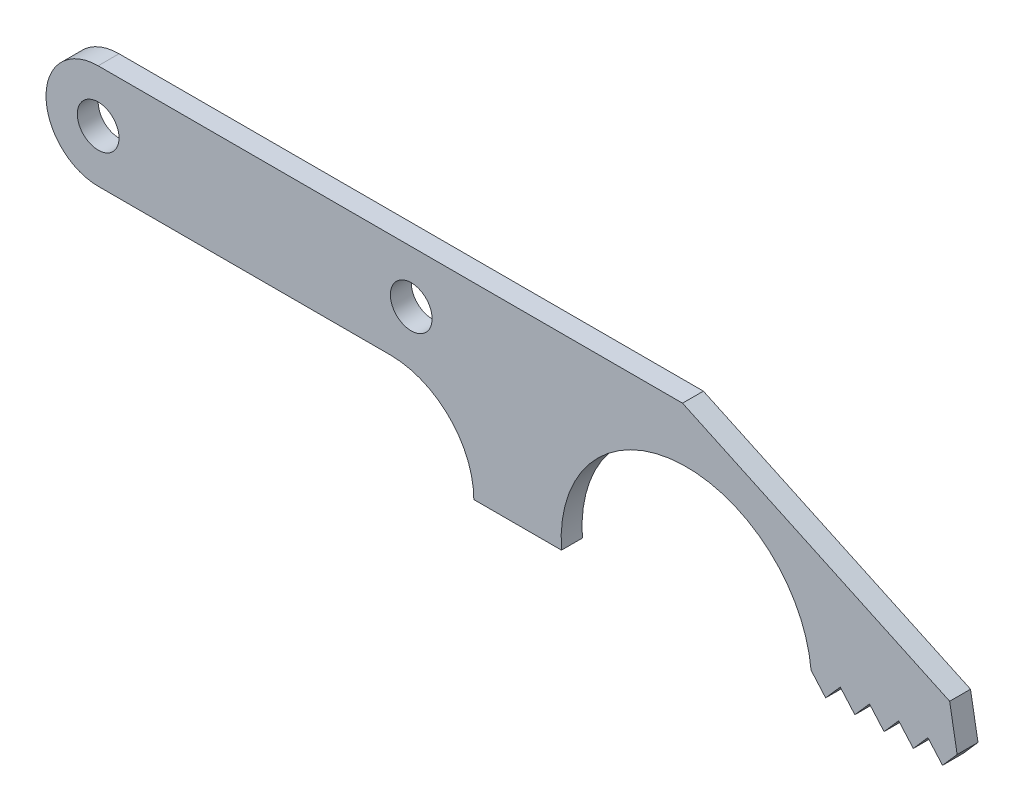
ISO-10303-21;
HEADER;
FILE_DESCRIPTION(('STEP AP214'),'2;1');
FILE_NAME('part.step','',(''),(''),'','','');
FILE_SCHEMA(('AUTOMOTIVE_DESIGN { 1 0 10303 214 1 1 1 1 }'));
ENDSEC;
DATA;
#1=APPLICATION_CONTEXT('core data for automotive mechanical design processes');
#2=APPLICATION_PROTOCOL_DEFINITION('international standard','automotive_design',2000,#1);
#3=PRODUCT_CONTEXT('',#1,'mechanical');
#4=PRODUCT('Part','Part','',(#3));
#5=PRODUCT_RELATED_PRODUCT_CATEGORY('part','',(#4));
#6=PRODUCT_DEFINITION_FORMATION('','',#4);
#7=PRODUCT_DEFINITION_CONTEXT('part definition',#1,'design');
#8=PRODUCT_DEFINITION('design','',#6,#7);
#9=PRODUCT_DEFINITION_SHAPE('','',#8);
#10=(LENGTH_UNIT() NAMED_UNIT(*) SI_UNIT(.MILLI.,.METRE.));
#11=(NAMED_UNIT(*) PLANE_ANGLE_UNIT() SI_UNIT($,.RADIAN.));
#12=(NAMED_UNIT(*) SI_UNIT($,.STERADIAN.) SOLID_ANGLE_UNIT());
#13=UNCERTAINTY_MEASURE_WITH_UNIT(LENGTH_MEASURE(1.E-05),#10,'distance_accuracy_value','');
#14=(GEOMETRIC_REPRESENTATION_CONTEXT(3) GLOBAL_UNCERTAINTY_ASSIGNED_CONTEXT((#13)) GLOBAL_UNIT_ASSIGNED_CONTEXT((#10,
#11,#12)) REPRESENTATION_CONTEXT('',''));
#15=CARTESIAN_POINT('',(0.,0.,0.));
#16=DIRECTION('',(0.,0.,1.));
#17=DIRECTION('',(1.,0.,0.));
#18=AXIS2_PLACEMENT_3D('',#15,#16,#17);
#19=CARTESIAN_POINT('',(0.,25.,2.5));
#20=DIRECTION('',(0.,1.,0.));
#21=DIRECTION('',(0.,0.,1.));
#22=AXIS2_PLACEMENT_3D('',#19,#20,#21);
#23=PLANE('',#22);
#24=DIRECTION('',(1.,0.,0.));
#25=VECTOR('',#24,1.);
#26=CARTESIAN_POINT('',(0.,25.,-2.5));
#27=LINE('',#26,#25);
#28=CARTESIAN_POINT('',(0.,25.,-2.5));
#29=VERTEX_POINT('',#28);
#30=CARTESIAN_POINT('',(140.,25.,-2.5));
#31=VERTEX_POINT('',#30);
#32=EDGE_CURVE('E214',#29,#31,#27,.T.);
#33=ORIENTED_EDGE('',*,*,#32,.F.);
#34=DIRECTION('',(0.,0.,-1.));
#35=VECTOR('',#34,1.);
#36=CARTESIAN_POINT('',(0.,25.,2.5));
#37=LINE('',#36,#35);
#38=CARTESIAN_POINT('',(0.,25.,2.5));
#39=VERTEX_POINT('',#38);
#40=EDGE_CURVE('E11',#39,#29,#37,.T.);
#41=ORIENTED_EDGE('',*,*,#40,.F.);
#42=DIRECTION('',(1.,0.,0.));
#43=VECTOR('',#42,1.);
#44=CARTESIAN_POINT('',(0.,25.,2.5));
#45=LINE('',#44,#43);
#46=CARTESIAN_POINT('',(140.,25.,2.5));
#47=VERTEX_POINT('',#46);
#48=EDGE_CURVE('E621',#39,#47,#45,.T.);
#49=ORIENTED_EDGE('',*,*,#48,.T.);
#50=DIRECTION('',(0.,0.,-1.));
#51=VECTOR('',#50,1.);
#52=CARTESIAN_POINT('',(140.,25.,2.5));
#53=LINE('',#52,#51);
#54=EDGE_CURVE('E65',#47,#31,#53,.T.);
#55=ORIENTED_EDGE('',*,*,#54,.T.);
#56=EDGE_LOOP('',(#33,#41,#49,#55));
#57=FACE_BOUND('',#56,.T.);
#58=ADVANCED_FACE('F47',(#57),#23,.T.);
#59=CARTESIAN_POINT('',(0.,12.5,2.5));
#60=DIRECTION('',(0.,0.,-1.));
#61=DIRECTION('',(-1.,0.,0.));
#62=AXIS2_PLACEMENT_3D('',#59,#60,#61);
#63=CYLINDRICAL_SURFACE('',#62,12.5);
#64=CARTESIAN_POINT('',(0.,12.5,-2.5));
#65=DIRECTION('',(0.,0.,1.));
#66=DIRECTION('',(1.,0.,0.));
#67=AXIS2_PLACEMENT_3D('',#64,#65,#66);
#68=CIRCLE('',#67,12.5);
#69=CARTESIAN_POINT('',(0.,0.,-2.5));
#70=VERTEX_POINT('',#69);
#71=EDGE_CURVE('E217',#29,#70,#68,.T.);
#72=ORIENTED_EDGE('',*,*,#71,.T.);
#73=DIRECTION('',(0.,0.,-1.));
#74=VECTOR('',#73,1.);
#75=CARTESIAN_POINT('',(0.,0.,2.5));
#76=LINE('',#75,#74);
#77=CARTESIAN_POINT('',(0.,0.,2.5));
#78=VERTEX_POINT('',#77);
#79=EDGE_CURVE('E57',#78,#70,#76,.T.);
#80=ORIENTED_EDGE('',*,*,#79,.F.);
#81=CARTESIAN_POINT('',(0.,12.5,2.5));
#82=DIRECTION('',(0.,0.,1.));
#83=DIRECTION('',(1.,0.,0.));
#84=AXIS2_PLACEMENT_3D('',#81,#82,#83);
#85=CIRCLE('',#84,12.5);
#86=EDGE_CURVE('E573',#39,#78,#85,.T.);
#87=ORIENTED_EDGE('',*,*,#86,.F.);
#88=ORIENTED_EDGE('',*,*,#40,.T.);
#89=EDGE_LOOP('',(#72,#80,#87,#88));
#90=FACE_BOUND('',#89,.T.);
#91=ADVANCED_FACE('F347',(#90),#63,.T.);
#92=CARTESIAN_POINT('',(0.,0.,2.5));
#93=DIRECTION('',(0.,1.,0.));
#94=DIRECTION('',(0.,0.,1.));
#95=AXIS2_PLACEMENT_3D('',#92,#93,#94);
#96=PLANE('',#95);
#97=DIRECTION('',(1.,0.,0.));
#98=VECTOR('',#97,1.);
#99=CARTESIAN_POINT('',(0.,0.,-2.5));
#100=LINE('',#99,#98);
#101=CARTESIAN_POINT('',(70.,0.,-2.5));
#102=VERTEX_POINT('',#101);
#103=EDGE_CURVE('E221',#70,#102,#100,.T.);
#104=ORIENTED_EDGE('',*,*,#103,.T.);
#105=DIRECTION('',(0.,0.,-1.));
#106=VECTOR('',#105,1.);
#107=CARTESIAN_POINT('',(70.,0.,2.5));
#108=LINE('',#107,#106);
#109=CARTESIAN_POINT('',(70.,0.,2.5));
#110=VERTEX_POINT('',#109);
#111=EDGE_CURVE('E333',#110,#102,#108,.T.);
#112=ORIENTED_EDGE('',*,*,#111,.F.);
#113=DIRECTION('',(1.,0.,0.));
#114=VECTOR('',#113,1.);
#115=CARTESIAN_POINT('',(0.,0.,2.5));
#116=LINE('',#115,#114);
#117=EDGE_CURVE('E343',#78,#110,#116,.T.);
#118=ORIENTED_EDGE('',*,*,#117,.F.);
#119=ORIENTED_EDGE('',*,*,#79,.T.);
#120=EDGE_LOOP('',(#104,#112,#118,#119));
#121=FACE_BOUND('',#120,.T.);
#122=ADVANCED_FACE('F340',(#121),#96,.F.);
#123=CARTESIAN_POINT('',(70.,-20.,2.5));
#124=DIRECTION('',(0.,0.,-1.));
#125=DIRECTION('',(-1.,0.,0.));
#126=AXIS2_PLACEMENT_3D('',#123,#124,#125);
#127=CYLINDRICAL_SURFACE('',#126,20.);
#128=CARTESIAN_POINT('',(70.,-20.,-2.5));
#129=DIRECTION('',(0.,0.,1.));
#130=DIRECTION('',(1.,0.,0.));
#131=AXIS2_PLACEMENT_3D('',#128,#129,#130);
#132=CIRCLE('',#131,20.);
#133=CARTESIAN_POINT('',(90.,-20.,-2.5));
#134=VERTEX_POINT('',#133);
#135=EDGE_CURVE('E225',#102,#134,#132,.F.);
#136=ORIENTED_EDGE('',*,*,#135,.T.);
#137=DIRECTION('',(0.,0.,-1.));
#138=VECTOR('',#137,1.);
#139=CARTESIAN_POINT('',(90.,-20.,2.5));
#140=LINE('',#139,#138);
#141=CARTESIAN_POINT('',(90.,-20.,2.5));
#142=VERTEX_POINT('',#141);
#143=EDGE_CURVE('E329',#142,#134,#140,.T.);
#144=ORIENTED_EDGE('',*,*,#143,.F.);
#145=CARTESIAN_POINT('',(70.,-20.,2.5));
#146=DIRECTION('',(0.,0.,1.));
#147=DIRECTION('',(1.,0.,0.));
#148=AXIS2_PLACEMENT_3D('',#145,#146,#147);
#149=CIRCLE('',#148,20.);
#150=EDGE_CURVE('E568',#110,#142,#149,.F.);
#151=ORIENTED_EDGE('',*,*,#150,.F.);
#152=ORIENTED_EDGE('',*,*,#111,.T.);
#153=EDGE_LOOP('',(#136,#144,#151,#152));
#154=FACE_BOUND('',#153,.T.);
#155=ADVANCED_FACE('F429',(#154),#127,.F.);
#156=CARTESIAN_POINT('',(0.,-20.,2.5));
#157=DIRECTION('',(0.,1.,0.));
#158=DIRECTION('',(0.,0.,1.));
#159=AXIS2_PLACEMENT_3D('',#156,#157,#158);
#160=PLANE('',#159);
#161=DIRECTION('',(1.,0.,0.));
#162=VECTOR('',#161,1.);
#163=CARTESIAN_POINT('',(0.,-20.,-2.5));
#164=LINE('',#163,#162);
#165=CARTESIAN_POINT('',(111.,-20.,-2.5));
#166=VERTEX_POINT('',#165);
#167=EDGE_CURVE('E229',#134,#166,#164,.T.);
#168=ORIENTED_EDGE('',*,*,#167,.T.);
#169=DIRECTION('',(0.,0.,-1.));
#170=VECTOR('',#169,1.);
#171=CARTESIAN_POINT('',(111.,-20.,2.5));
#172=LINE('',#171,#170);
#173=CARTESIAN_POINT('',(111.,-20.,2.5));
#174=VERTEX_POINT('',#173);
#175=EDGE_CURVE('E325',#174,#166,#172,.T.);
#176=ORIENTED_EDGE('',*,*,#175,.F.);
#177=DIRECTION('',(1.,0.,0.));
#178=VECTOR('',#177,1.);
#179=CARTESIAN_POINT('',(0.,-20.,2.5));
#180=LINE('',#179,#178);
#181=EDGE_CURVE('E563',#142,#174,#180,.T.);
#182=ORIENTED_EDGE('',*,*,#181,.F.);
#183=ORIENTED_EDGE('',*,*,#143,.T.);
#184=EDGE_LOOP('',(#168,#176,#182,#183));
#185=FACE_BOUND('',#184,.T.);
#186=ADVANCED_FACE('F425',(#185),#160,.F.);
#187=CARTESIAN_POINT('',(140.914787694969,-17.7404697025836,2.5));
#188=DIRECTION('',(0.,0.,-1.));
#189=DIRECTION('',(-1.,0.,0.));
#190=AXIS2_PLACEMENT_3D('',#187,#188,#189);
#191=CYLINDRICAL_SURFACE('',#190,30.);
#192=CARTESIAN_POINT('',(140.914787694969,-17.7404697025836,-2.5));
#193=DIRECTION('',(0.,0.,1.));
#194=DIRECTION('',(1.,0.,0.));
#195=AXIS2_PLACEMENT_3D('',#192,#193,#194);
#196=CIRCLE('',#195,30.);
#197=CARTESIAN_POINT('',(170.789355906229,-15.,-2.5));
#198=VERTEX_POINT('',#197);
#199=EDGE_CURVE('E233',#166,#198,#196,.F.);
#200=ORIENTED_EDGE('',*,*,#199,.T.);
#201=DIRECTION('',(0.,0.,-1.));
#202=VECTOR('',#201,1.);
#203=CARTESIAN_POINT('',(170.789355906229,-15.,2.5));
#204=LINE('',#203,#202);
#205=CARTESIAN_POINT('',(170.789355906229,-15.,2.5));
#206=VERTEX_POINT('',#205);
#207=EDGE_CURVE('E321',#206,#198,#204,.T.);
#208=ORIENTED_EDGE('',*,*,#207,.F.);
#209=CARTESIAN_POINT('',(140.914787694969,-17.7404697025836,2.5));
#210=DIRECTION('',(0.,0.,1.));
#211=DIRECTION('',(1.,0.,0.));
#212=AXIS2_PLACEMENT_3D('',#209,#210,#211);
#213=CIRCLE('',#212,30.);
#214=EDGE_CURVE('E567',#174,#206,#213,.F.);
#215=ORIENTED_EDGE('',*,*,#214,.F.);
#216=ORIENTED_EDGE('',*,*,#175,.T.);
#217=EDGE_LOOP('',(#200,#208,#215,#216));
#218=FACE_BOUND('',#217,.T.);
#219=ADVANCED_FACE('F421',(#218),#191,.F.);
#220=CARTESIAN_POINT('',(89.2966263539702,78.134548059724,2.5));
#221=DIRECTION('',(0.752576694706878,0.658504607868518,0.));
#222=DIRECTION('',(-0.658504607868518,0.752576694706878,0.));
#223=AXIS2_PLACEMENT_3D('',#220,#221,#222);
#224=PLANE('',#223);
#225=DIRECTION('',(0.658504607868518,-0.752576694706878,0.));
#226=VECTOR('',#225,1.);
#227=CARTESIAN_POINT('',(89.2966263539702,78.134548059724,-2.5));
#228=LINE('',#227,#226);
#229=CARTESIAN_POINT('',(174.289355906229,-19.,-2.5));
#230=VERTEX_POINT('',#229);
#231=EDGE_CURVE('E237',#198,#230,#228,.T.);
#232=ORIENTED_EDGE('',*,*,#231,.T.);
#233=DIRECTION('',(0.,0.,-1.));
#234=VECTOR('',#233,1.);
#235=CARTESIAN_POINT('',(174.289355906229,-19.,2.5));
#236=LINE('',#235,#234);
#237=CARTESIAN_POINT('',(174.289355906229,-19.,2.5));
#238=VERTEX_POINT('',#237);
#239=EDGE_CURVE('E317',#238,#230,#236,.T.);
#240=ORIENTED_EDGE('',*,*,#239,.F.);
#241=DIRECTION('',(0.658504607868518,-0.752576694706878,0.));
#242=VECTOR('',#241,1.);
#243=CARTESIAN_POINT('',(89.2966263539702,78.134548059724,2.5));
#244=LINE('',#243,#242);
#245=EDGE_CURVE('E579',#206,#238,#244,.T.);
#246=ORIENTED_EDGE('',*,*,#245,.F.);
#247=ORIENTED_EDGE('',*,*,#207,.T.);
#248=EDGE_LOOP('',(#232,#240,#246,#247));
#249=FACE_BOUND('',#248,.T.);
#250=ADVANCED_FACE('F417',(#249),#224,.F.);
#251=CARTESIAN_POINT('',(108.12848476105,-94.6124241659187,2.5));
#252=DIRECTION('',(-0.752576694706877,0.658504607868519,0.));
#253=DIRECTION('',(-0.658504607868519,-0.752576694706877,0.));
#254=AXIS2_PLACEMENT_3D('',#251,#252,#253);
#255=PLANE('',#254);
#256=DIRECTION('',(0.658504607868519,0.752576694706877,0.));
#257=VECTOR('',#256,1.);
#258=CARTESIAN_POINT('',(108.12848476105,-94.6124241659187,-2.5));
#259=LINE('',#258,#257);
#260=CARTESIAN_POINT('',(177.789355906229,-15.,-2.5));
#261=VERTEX_POINT('',#260);
#262=EDGE_CURVE('E241',#230,#261,#259,.T.);
#263=ORIENTED_EDGE('',*,*,#262,.T.);
#264=DIRECTION('',(0.,0.,-1.));
#265=VECTOR('',#264,1.);
#266=CARTESIAN_POINT('',(177.789355906229,-15.,2.5));
#267=LINE('',#266,#265);
#268=CARTESIAN_POINT('',(177.789355906229,-15.,2.5));
#269=VERTEX_POINT('',#268);
#270=EDGE_CURVE('E313',#269,#261,#267,.T.);
#271=ORIENTED_EDGE('',*,*,#270,.F.);
#272=DIRECTION('',(0.658504607868519,0.752576694706877,0.));
#273=VECTOR('',#272,1.);
#274=CARTESIAN_POINT('',(108.12848476105,-94.6124241659187,2.5));
#275=LINE('',#274,#273);
#276=EDGE_CURVE('E583',#238,#269,#275,.T.);
#277=ORIENTED_EDGE('',*,*,#276,.F.);
#278=ORIENTED_EDGE('',*,*,#239,.T.);
#279=EDGE_LOOP('',(#263,#271,#277,#278));
#280=FACE_BOUND('',#279,.T.);
#281=ADVANCED_FACE('F413',(#280),#255,.F.);
#282=CARTESIAN_POINT('',(93.2612281238816,81.6035746083965,2.5));
#283=DIRECTION('',(0.752576694706877,0.658504607868519,0.));
#284=DIRECTION('',(-0.658504607868519,0.752576694706877,0.));
#285=AXIS2_PLACEMENT_3D('',#282,#283,#284);
#286=PLANE('',#285);
#287=DIRECTION('',(0.658504607868519,-0.752576694706877,0.));
#288=VECTOR('',#287,1.);
#289=CARTESIAN_POINT('',(93.2612281238816,81.6035746083965,-2.5));
#290=LINE('',#289,#288);
#291=CARTESIAN_POINT('',(181.289355906229,-19.,-2.5));
#292=VERTEX_POINT('',#291);
#293=EDGE_CURVE('E245',#261,#292,#290,.T.);
#294=ORIENTED_EDGE('',*,*,#293,.T.);
#295=DIRECTION('',(0.,0.,-1.));
#296=VECTOR('',#295,1.);
#297=CARTESIAN_POINT('',(181.289355906229,-19.,2.5));
#298=LINE('',#297,#296);
#299=CARTESIAN_POINT('',(181.289355906229,-19.,2.5));
#300=VERTEX_POINT('',#299);
#301=EDGE_CURVE('E309',#300,#292,#298,.T.);
#302=ORIENTED_EDGE('',*,*,#301,.F.);
#303=DIRECTION('',(0.658504607868519,-0.752576694706877,0.));
#304=VECTOR('',#303,1.);
#305=CARTESIAN_POINT('',(93.2612281238816,81.6035746083965,2.5));
#306=LINE('',#305,#304);
#307=EDGE_CURVE('E587',#269,#300,#306,.T.);
#308=ORIENTED_EDGE('',*,*,#307,.F.);
#309=ORIENTED_EDGE('',*,*,#270,.T.);
#310=EDGE_LOOP('',(#294,#302,#308,#309));
#311=FACE_BOUND('',#310,.T.);
#312=ADVANCED_FACE('F409',(#311),#286,.F.);
#313=CARTESIAN_POINT('',(112.093086530961,-98.0814507145913,2.5));
#314=DIRECTION('',(-0.752576694706877,0.658504607868519,0.));
#315=DIRECTION('',(-0.658504607868519,-0.752576694706877,0.));
#316=AXIS2_PLACEMENT_3D('',#313,#314,#315);
#317=PLANE('',#316);
#318=DIRECTION('',(0.658504607868519,0.752576694706877,0.));
#319=VECTOR('',#318,1.);
#320=CARTESIAN_POINT('',(112.093086530961,-98.0814507145913,-2.5));
#321=LINE('',#320,#319);
#322=CARTESIAN_POINT('',(184.789355906229,-15.,-2.5));
#323=VERTEX_POINT('',#322);
#324=EDGE_CURVE('E249',#292,#323,#321,.T.);
#325=ORIENTED_EDGE('',*,*,#324,.T.);
#326=DIRECTION('',(0.,0.,-1.));
#327=VECTOR('',#326,1.);
#328=CARTESIAN_POINT('',(184.789355906229,-15.,2.5));
#329=LINE('',#328,#327);
#330=CARTESIAN_POINT('',(184.789355906229,-15.,2.5));
#331=VERTEX_POINT('',#330);
#332=EDGE_CURVE('E305',#331,#323,#329,.T.);
#333=ORIENTED_EDGE('',*,*,#332,.F.);
#334=DIRECTION('',(0.658504607868519,0.752576694706877,0.));
#335=VECTOR('',#334,1.);
#336=CARTESIAN_POINT('',(112.093086530961,-98.0814507145913,2.5));
#337=LINE('',#336,#335);
#338=EDGE_CURVE('E591',#300,#331,#337,.T.);
#339=ORIENTED_EDGE('',*,*,#338,.F.);
#340=ORIENTED_EDGE('',*,*,#301,.T.);
#341=EDGE_LOOP('',(#325,#333,#339,#340));
#342=FACE_BOUND('',#341,.T.);
#343=ADVANCED_FACE('F405',(#342),#317,.F.);
#344=CARTESIAN_POINT('',(97.2258298937931,85.0726011570691,2.5));
#345=DIRECTION('',(0.752576694706877,0.658504607868519,0.));
#346=DIRECTION('',(-0.658504607868519,0.752576694706877,0.));
#347=AXIS2_PLACEMENT_3D('',#344,#345,#346);
#348=PLANE('',#347);
#349=DIRECTION('',(0.658504607868519,-0.752576694706877,0.));
#350=VECTOR('',#349,1.);
#351=CARTESIAN_POINT('',(97.2258298937931,85.0726011570691,-2.5));
#352=LINE('',#351,#350);
#353=CARTESIAN_POINT('',(188.289355906229,-19.,-2.5));
#354=VERTEX_POINT('',#353);
#355=EDGE_CURVE('E253',#323,#354,#352,.T.);
#356=ORIENTED_EDGE('',*,*,#355,.T.);
#357=DIRECTION('',(0.,0.,-1.));
#358=VECTOR('',#357,1.);
#359=CARTESIAN_POINT('',(188.289355906229,-19.,2.5));
#360=LINE('',#359,#358);
#361=CARTESIAN_POINT('',(188.289355906229,-19.,2.5));
#362=VERTEX_POINT('',#361);
#363=EDGE_CURVE('E301',#362,#354,#360,.T.);
#364=ORIENTED_EDGE('',*,*,#363,.F.);
#365=DIRECTION('',(0.658504607868519,-0.752576694706877,0.));
#366=VECTOR('',#365,1.);
#367=CARTESIAN_POINT('',(97.2258298937931,85.0726011570691,2.5));
#368=LINE('',#367,#366);
#369=EDGE_CURVE('E595',#331,#362,#368,.T.);
#370=ORIENTED_EDGE('',*,*,#369,.F.);
#371=ORIENTED_EDGE('',*,*,#332,.T.);
#372=EDGE_LOOP('',(#356,#364,#370,#371));
#373=FACE_BOUND('',#372,.T.);
#374=ADVANCED_FACE('F401',(#373),#348,.F.);
#375=CARTESIAN_POINT('',(116.057688300873,-101.550477263264,2.5));
#376=DIRECTION('',(-0.752576694706877,0.658504607868519,0.));
#377=DIRECTION('',(-0.658504607868519,-0.752576694706877,0.));
#378=AXIS2_PLACEMENT_3D('',#375,#376,#377);
#379=PLANE('',#378);
#380=DIRECTION('',(0.658504607868519,0.752576694706877,0.));
#381=VECTOR('',#380,1.);
#382=CARTESIAN_POINT('',(116.057688300873,-101.550477263264,-2.5));
#383=LINE('',#382,#381);
#384=CARTESIAN_POINT('',(191.789355906229,-15.,-2.5));
#385=VERTEX_POINT('',#384);
#386=EDGE_CURVE('E257',#354,#385,#383,.T.);
#387=ORIENTED_EDGE('',*,*,#386,.T.);
#388=DIRECTION('',(0.,0.,-1.));
#389=VECTOR('',#388,1.);
#390=CARTESIAN_POINT('',(191.789355906229,-15.,2.5));
#391=LINE('',#390,#389);
#392=CARTESIAN_POINT('',(191.789355906229,-15.,2.5));
#393=VERTEX_POINT('',#392);
#394=EDGE_CURVE('E297',#393,#385,#391,.T.);
#395=ORIENTED_EDGE('',*,*,#394,.F.);
#396=DIRECTION('',(0.658504607868519,0.752576694706877,0.));
#397=VECTOR('',#396,1.);
#398=CARTESIAN_POINT('',(116.057688300873,-101.550477263264,2.5));
#399=LINE('',#398,#397);
#400=EDGE_CURVE('E599',#362,#393,#399,.T.);
#401=ORIENTED_EDGE('',*,*,#400,.F.);
#402=ORIENTED_EDGE('',*,*,#363,.T.);
#403=EDGE_LOOP('',(#387,#395,#401,#402));
#404=FACE_BOUND('',#403,.T.);
#405=ADVANCED_FACE('F397',(#404),#379,.F.);
#406=CARTESIAN_POINT('',(101.190431663705,88.5416277057416,2.5));
#407=DIRECTION('',(0.75257669470688,0.658504607868516,0.));
#408=DIRECTION('',(-0.658504607868516,0.75257669470688,0.));
#409=AXIS2_PLACEMENT_3D('',#406,#407,#408);
#410=PLANE('',#409);
#411=DIRECTION('',(0.658504607868516,-0.75257669470688,0.));
#412=VECTOR('',#411,1.);
#413=CARTESIAN_POINT('',(101.190431663705,88.5416277057416,-2.5));
#414=LINE('',#413,#412);
#415=CARTESIAN_POINT('',(195.289355906229,-19.,-2.5));
#416=VERTEX_POINT('',#415);
#417=EDGE_CURVE('E261',#385,#416,#414,.T.);
#418=ORIENTED_EDGE('',*,*,#417,.T.);
#419=DIRECTION('',(0.,0.,-1.));
#420=VECTOR('',#419,1.);
#421=CARTESIAN_POINT('',(195.289355906229,-19.,2.5));
#422=LINE('',#421,#420);
#423=CARTESIAN_POINT('',(195.289355906229,-19.,2.5));
#424=VERTEX_POINT('',#423);
#425=EDGE_CURVE('E293',#424,#416,#422,.T.);
#426=ORIENTED_EDGE('',*,*,#425,.F.);
#427=DIRECTION('',(0.658504607868516,-0.75257669470688,0.));
#428=VECTOR('',#427,1.);
#429=CARTESIAN_POINT('',(101.190431663705,88.5416277057416,2.5));
#430=LINE('',#429,#428);
#431=EDGE_CURVE('E603',#393,#424,#430,.T.);
#432=ORIENTED_EDGE('',*,*,#431,.F.);
#433=ORIENTED_EDGE('',*,*,#394,.T.);
#434=EDGE_LOOP('',(#418,#426,#432,#433));
#435=FACE_BOUND('',#434,.T.);
#436=ADVANCED_FACE('F393',(#435),#410,.F.);
#437=CARTESIAN_POINT('',(120.022290070784,-105.019503811936,2.5));
#438=DIRECTION('',(-0.752576694706877,0.658504607868519,0.));
#439=DIRECTION('',(-0.658504607868519,-0.752576694706877,0.));
#440=AXIS2_PLACEMENT_3D('',#437,#438,#439);
#441=PLANE('',#440);
#442=DIRECTION('',(0.658504607868519,0.752576694706877,0.));
#443=VECTOR('',#442,1.);
#444=CARTESIAN_POINT('',(120.022290070784,-105.019503811936,-2.5));
#445=LINE('',#444,#443);
#446=CARTESIAN_POINT('',(198.789355906229,-15.,-2.5));
#447=VERTEX_POINT('',#446);
#448=EDGE_CURVE('E265',#416,#447,#445,.T.);
#449=ORIENTED_EDGE('',*,*,#448,.T.);
#450=DIRECTION('',(0.,0.,-1.));
#451=VECTOR('',#450,1.);
#452=CARTESIAN_POINT('',(198.789355906229,-15.,2.5));
#453=LINE('',#452,#451);
#454=CARTESIAN_POINT('',(198.789355906229,-15.,2.5));
#455=VERTEX_POINT('',#454);
#456=EDGE_CURVE('E289',#455,#447,#453,.T.);
#457=ORIENTED_EDGE('',*,*,#456,.F.);
#458=DIRECTION('',(0.658504607868519,0.752576694706877,0.));
#459=VECTOR('',#458,1.);
#460=CARTESIAN_POINT('',(120.022290070784,-105.019503811936,2.5));
#461=LINE('',#460,#459);
#462=EDGE_CURVE('E607',#424,#455,#461,.T.);
#463=ORIENTED_EDGE('',*,*,#462,.F.);
#464=ORIENTED_EDGE('',*,*,#425,.T.);
#465=EDGE_LOOP('',(#449,#457,#463,#464));
#466=FACE_BOUND('',#465,.T.);
#467=ADVANCED_FACE('F389',(#466),#441,.F.);
#468=CARTESIAN_POINT('',(105.155033433616,92.0106542544142,2.5));
#469=DIRECTION('',(0.752576694706877,0.658504607868519,0.));
#470=DIRECTION('',(-0.658504607868519,0.752576694706877,0.));
#471=AXIS2_PLACEMENT_3D('',#468,#469,#470);
#472=PLANE('',#471);
#473=DIRECTION('',(0.658504607868519,-0.752576694706877,0.));
#474=VECTOR('',#473,1.);
#475=CARTESIAN_POINT('',(105.155033433616,92.0106542544142,-2.5));
#476=LINE('',#475,#474);
#477=CARTESIAN_POINT('',(202.289355906229,-19.,-2.5));
#478=VERTEX_POINT('',#477);
#479=EDGE_CURVE('E269',#447,#478,#476,.T.);
#480=ORIENTED_EDGE('',*,*,#479,.T.);
#481=DIRECTION('',(0.,0.,-1.));
#482=VECTOR('',#481,1.);
#483=CARTESIAN_POINT('',(202.289355906229,-19.,2.5));
#484=LINE('',#483,#482);
#485=CARTESIAN_POINT('',(202.289355906229,-19.,2.5));
#486=VERTEX_POINT('',#485);
#487=EDGE_CURVE('E196',#486,#478,#484,.T.);
#488=ORIENTED_EDGE('',*,*,#487,.F.);
#489=DIRECTION('',(0.658504607868519,-0.752576694706877,0.));
#490=VECTOR('',#489,1.);
#491=CARTESIAN_POINT('',(105.155033433616,92.0106542544142,2.5));
#492=LINE('',#491,#490);
#493=EDGE_CURVE('E183',#455,#486,#492,.T.);
#494=ORIENTED_EDGE('',*,*,#493,.F.);
#495=ORIENTED_EDGE('',*,*,#456,.T.);
#496=EDGE_LOOP('',(#480,#488,#494,#495));
#497=FACE_BOUND('',#496,.T.);
#498=ADVANCED_FACE('F386',(#497),#472,.F.);
#499=CARTESIAN_POINT('',(123.986891840696,-108.488530360609,2.5));
#500=DIRECTION('',(-0.752576694706877,0.658504607868519,0.));
#501=DIRECTION('',(-0.658504607868519,-0.752576694706877,0.));
#502=AXIS2_PLACEMENT_3D('',#499,#500,#501);
#503=PLANE('',#502);
#504=DIRECTION('',(0.658504607868519,0.752576694706877,0.));
#505=VECTOR('',#504,1.);
#506=CARTESIAN_POINT('',(123.986891840696,-108.488530360609,-2.5));
#507=LINE('',#506,#505);
#508=CARTESIAN_POINT('',(205.789355906229,-15.,-2.5));
#509=VERTEX_POINT('',#508);
#510=EDGE_CURVE('E192',#478,#509,#507,.T.);
#511=ORIENTED_EDGE('',*,*,#510,.T.);
#512=DIRECTION('',(0.,0.,-1.));
#513=VECTOR('',#512,1.);
#514=CARTESIAN_POINT('',(205.789355906229,-15.,2.5));
#515=LINE('',#514,#513);
#516=CARTESIAN_POINT('',(205.789355906229,-15.,2.5));
#517=VERTEX_POINT('',#516);
#518=EDGE_CURVE('E190',#517,#509,#515,.T.);
#519=ORIENTED_EDGE('',*,*,#518,.F.);
#520=DIRECTION('',(0.658504607868519,0.752576694706877,0.));
#521=VECTOR('',#520,1.);
#522=CARTESIAN_POINT('',(123.986891840696,-108.488530360609,2.5));
#523=LINE('',#522,#521);
#524=EDGE_CURVE('E175',#486,#517,#523,.T.);
#525=ORIENTED_EDGE('',*,*,#524,.F.);
#526=ORIENTED_EDGE('',*,*,#487,.T.);
#527=EDGE_LOOP('',(#511,#519,#525,#526));
#528=FACE_BOUND('',#527,.T.);
#529=ADVANCED_FACE('F191',(#528),#503,.F.);
#530=CARTESIAN_POINT('',(197.018896468856,34.7397471568678,2.5));
#531=DIRECTION('',(0.984807753012207,0.173648177666934,0.));
#532=DIRECTION('',(-0.173648177666934,0.984807753012207,0.));
#533=AXIS2_PLACEMENT_3D('',#530,#531,#532);
#534=PLANE('',#533);
#535=DIRECTION('',(0.173648177666934,-0.984807753012207,0.));
#536=VECTOR('',#535,1.);
#537=CARTESIAN_POINT('',(197.018896468856,34.7397471568678,-2.5));
#538=LINE('',#537,#536);
#539=CARTESIAN_POINT('',(203.998392257483,-4.8429404192719,-2.5));
#540=VERTEX_POINT('',#539);
#541=EDGE_CURVE('E275',#540,#509,#538,.T.);
#542=ORIENTED_EDGE('',*,*,#541,.F.);
#543=DIRECTION('',(0.,0.,-1.));
#544=VECTOR('',#543,1.);
#545=CARTESIAN_POINT('',(203.998392257483,-4.8429404192719,2.5));
#546=LINE('',#545,#544);
#547=CARTESIAN_POINT('',(203.998392257483,-4.8429404192719,2.5));
#548=VERTEX_POINT('',#547);
#549=EDGE_CURVE('E120',#548,#540,#546,.T.);
#550=ORIENTED_EDGE('',*,*,#549,.F.);
#551=DIRECTION('',(0.173648177666934,-0.984807753012207,0.));
#552=VECTOR('',#551,1.);
#553=CARTESIAN_POINT('',(197.018896468856,34.7397471568678,2.5));
#554=LINE('',#553,#552);
#555=EDGE_CURVE('E181',#548,#517,#554,.T.);
#556=ORIENTED_EDGE('',*,*,#555,.T.);
#557=ORIENTED_EDGE('',*,*,#518,.T.);
#558=EDGE_LOOP('',(#542,#550,#556,#557));
#559=FACE_BOUND('',#558,.T.);
#560=ADVANCED_FACE('F198',(#559),#534,.T.);
#561=CARTESIAN_POINT('',(0.,12.5,2.5));
#562=DIRECTION('',(0.,0.,-1.));
#563=DIRECTION('',(-1.,0.,0.));
#564=AXIS2_PLACEMENT_3D('',#561,#562,#563);
#565=CYLINDRICAL_SURFACE('',#564,5.);
#566=CARTESIAN_POINT('',(0.,12.5,2.5));
#567=DIRECTION('',(0.,0.,1.));
#568=DIRECTION('',(1.,0.,0.));
#569=AXIS2_PLACEMENT_3D('',#566,#567,#568);
#570=CIRCLE('',#569,5.);
#571=CARTESIAN_POINT('',(5.,12.5,2.5));
#572=VERTEX_POINT('',#571);
#573=EDGE_CURVE('E370',#572,#572,#570,.T.);
#574=ORIENTED_EDGE('',*,*,#573,.T.);
#575=EDGE_LOOP('',(#574));
#576=FACE_BOUND('',#575,.T.);
#577=CARTESIAN_POINT('',(0.,12.5,-2.5));
#578=DIRECTION('',(0.,0.,1.));
#579=DIRECTION('',(1.,0.,0.));
#580=AXIS2_PLACEMENT_3D('',#577,#578,#579);
#581=CIRCLE('',#580,5.);
#582=CARTESIAN_POINT('',(5.,12.5,-2.5));
#583=VERTEX_POINT('',#582);
#584=EDGE_CURVE('E210',#583,#583,#581,.T.);
#585=ORIENTED_EDGE('',*,*,#584,.F.);
#586=EDGE_LOOP('',(#585));
#587=FACE_BOUND('',#586,.T.);
#588=ADVANCED_FACE('F357',(#576,#587),#565,.F.);
#589=CARTESIAN_POINT('',(75.,12.5,2.5));
#590=DIRECTION('',(0.,0.,-1.));
#591=DIRECTION('',(-1.,0.,0.));
#592=AXIS2_PLACEMENT_3D('',#589,#590,#591);
#593=CYLINDRICAL_SURFACE('',#592,5.);
#594=CARTESIAN_POINT('',(75.,12.5,2.5));
#595=DIRECTION('',(0.,0.,1.));
#596=DIRECTION('',(1.,0.,0.));
#597=AXIS2_PLACEMENT_3D('',#594,#595,#596);
#598=CIRCLE('',#597,5.);
#599=CARTESIAN_POINT('',(80.,12.5,2.5));
#600=VERTEX_POINT('',#599);
#601=EDGE_CURVE('E282',#600,#600,#598,.T.);
#602=ORIENTED_EDGE('',*,*,#601,.T.);
#603=EDGE_LOOP('',(#602));
#604=FACE_BOUND('',#603,.T.);
#605=CARTESIAN_POINT('',(75.,12.5,-2.5));
#606=DIRECTION('',(0.,0.,1.));
#607=DIRECTION('',(1.,0.,0.));
#608=AXIS2_PLACEMENT_3D('',#605,#606,#607);
#609=CIRCLE('',#608,5.);
#610=CARTESIAN_POINT('',(80.,12.5,-2.5));
#611=VERTEX_POINT('',#610);
#612=EDGE_CURVE('E206',#611,#611,#609,.T.);
#613=ORIENTED_EDGE('',*,*,#612,.F.);
#614=EDGE_LOOP('',(#613));
#615=FACE_BOUND('',#614,.T.);
#616=ADVANCED_FACE('F49',(#604,#615),#593,.F.);
#617=CARTESIAN_POINT('',(34.5804228609296,74.1579561394103,2.5));
#618=DIRECTION('',(0.4226182617407,0.90630778703665,0.));
#619=DIRECTION('',(-0.90630778703665,0.4226182617407,0.));
#620=AXIS2_PLACEMENT_3D('',#617,#618,#619);
#621=PLANE('',#620);
#622=DIRECTION('',(0.90630778703665,-0.4226182617407,0.));
#623=VECTOR('',#622,1.);
#624=CARTESIAN_POINT('',(34.5804228609296,74.1579561394103,-2.5));
#625=LINE('',#624,#623);
#626=EDGE_CURVE('E278',#31,#540,#625,.T.);
#627=ORIENTED_EDGE('',*,*,#626,.F.);
#628=ORIENTED_EDGE('',*,*,#54,.F.);
#629=DIRECTION('',(0.90630778703665,-0.4226182617407,0.));
#630=VECTOR('',#629,1.);
#631=CARTESIAN_POINT('',(34.5804228609296,74.1579561394103,2.5));
#632=LINE('',#631,#630);
#633=EDGE_CURVE('E200',#47,#548,#632,.T.);
#634=ORIENTED_EDGE('',*,*,#633,.T.);
#635=ORIENTED_EDGE('',*,*,#549,.T.);
#636=EDGE_LOOP('',(#627,#628,#634,#635));
#637=FACE_BOUND('',#636,.T.);
#638=ADVANCED_FACE('F364',(#637),#621,.T.);
#639=CARTESIAN_POINT('',(0.,0.,2.5));
#640=DIRECTION('',(0.,0.,1.));
#641=DIRECTION('',(1.,0.,0.));
#642=AXIS2_PLACEMENT_3D('',#639,#640,#641);
#643=PLANE('',#642);
#644=ORIENTED_EDGE('',*,*,#601,.F.);
#645=EDGE_LOOP('',(#644));
#646=FACE_BOUND('',#645,.T.);
#647=ORIENTED_EDGE('',*,*,#573,.F.);
#648=EDGE_LOOP('',(#647));
#649=FACE_BOUND('',#648,.T.);
#650=ORIENTED_EDGE('',*,*,#48,.F.);
#651=ORIENTED_EDGE('',*,*,#86,.T.);
#652=ORIENTED_EDGE('',*,*,#117,.T.);
#653=ORIENTED_EDGE('',*,*,#150,.T.);
#654=ORIENTED_EDGE('',*,*,#181,.T.);
#655=ORIENTED_EDGE('',*,*,#214,.T.);
#656=ORIENTED_EDGE('',*,*,#245,.T.);
#657=ORIENTED_EDGE('',*,*,#276,.T.);
#658=ORIENTED_EDGE('',*,*,#307,.T.);
#659=ORIENTED_EDGE('',*,*,#338,.T.);
#660=ORIENTED_EDGE('',*,*,#369,.T.);
#661=ORIENTED_EDGE('',*,*,#400,.T.);
#662=ORIENTED_EDGE('',*,*,#431,.T.);
#663=ORIENTED_EDGE('',*,*,#462,.T.);
#664=ORIENTED_EDGE('',*,*,#493,.T.);
#665=ORIENTED_EDGE('',*,*,#524,.T.);
#666=ORIENTED_EDGE('',*,*,#555,.F.);
#667=ORIENTED_EDGE('',*,*,#633,.F.);
#668=EDGE_LOOP('',(#650,#651,#652,#653,#654,#655,#656,#657,#658,#659,#660,#661,#662,#663,#664,
#665,#666,#667));
#669=FACE_BOUND('',#668,.T.);
#670=ADVANCED_FACE('F178',(#646,#649,#669),#643,.T.);
#671=CARTESIAN_POINT('',(0.,0.,-2.5));
#672=DIRECTION('',(0.,0.,1.));
#673=DIRECTION('',(1.,0.,0.));
#674=AXIS2_PLACEMENT_3D('',#671,#672,#673);
#675=PLANE('',#674);
#676=ORIENTED_EDGE('',*,*,#612,.T.);
#677=EDGE_LOOP('',(#676));
#678=FACE_BOUND('',#677,.T.);
#679=ORIENTED_EDGE('',*,*,#584,.T.);
#680=EDGE_LOOP('',(#679));
#681=FACE_BOUND('',#680,.T.);
#682=ORIENTED_EDGE('',*,*,#32,.T.);
#683=ORIENTED_EDGE('',*,*,#626,.T.);
#684=ORIENTED_EDGE('',*,*,#541,.T.);
#685=ORIENTED_EDGE('',*,*,#510,.F.);
#686=ORIENTED_EDGE('',*,*,#479,.F.);
#687=ORIENTED_EDGE('',*,*,#448,.F.);
#688=ORIENTED_EDGE('',*,*,#417,.F.);
#689=ORIENTED_EDGE('',*,*,#386,.F.);
#690=ORIENTED_EDGE('',*,*,#355,.F.);
#691=ORIENTED_EDGE('',*,*,#324,.F.);
#692=ORIENTED_EDGE('',*,*,#293,.F.);
#693=ORIENTED_EDGE('',*,*,#262,.F.);
#694=ORIENTED_EDGE('',*,*,#231,.F.);
#695=ORIENTED_EDGE('',*,*,#199,.F.);
#696=ORIENTED_EDGE('',*,*,#167,.F.);
#697=ORIENTED_EDGE('',*,*,#135,.F.);
#698=ORIENTED_EDGE('',*,*,#103,.F.);
#699=ORIENTED_EDGE('',*,*,#71,.F.);
#700=EDGE_LOOP('',(#682,#683,#684,#685,#686,#687,#688,#689,#690,#691,#692,#693,#694,#695,#696,
#697,#698,#699));
#701=FACE_BOUND('',#700,.T.);
#702=ADVANCED_FACE('F349',(#678,#681,#701),#675,.F.);
#703=CLOSED_SHELL('',(#58,#91,#122,#155,#186,#219,#250,#281,#312,#343,#374,#405,#436,#467,#498,
#529,#560,#588,#616,#638,#670,#702));
#704=MANIFOLD_SOLID_BREP('B2',#703);
#705=ADVANCED_BREP_SHAPE_REPRESENTATION('',(#18,#704),#14);
#706=SHAPE_DEFINITION_REPRESENTATION(#9,#705);
ENDSEC;
END-ISO-10303-21;
